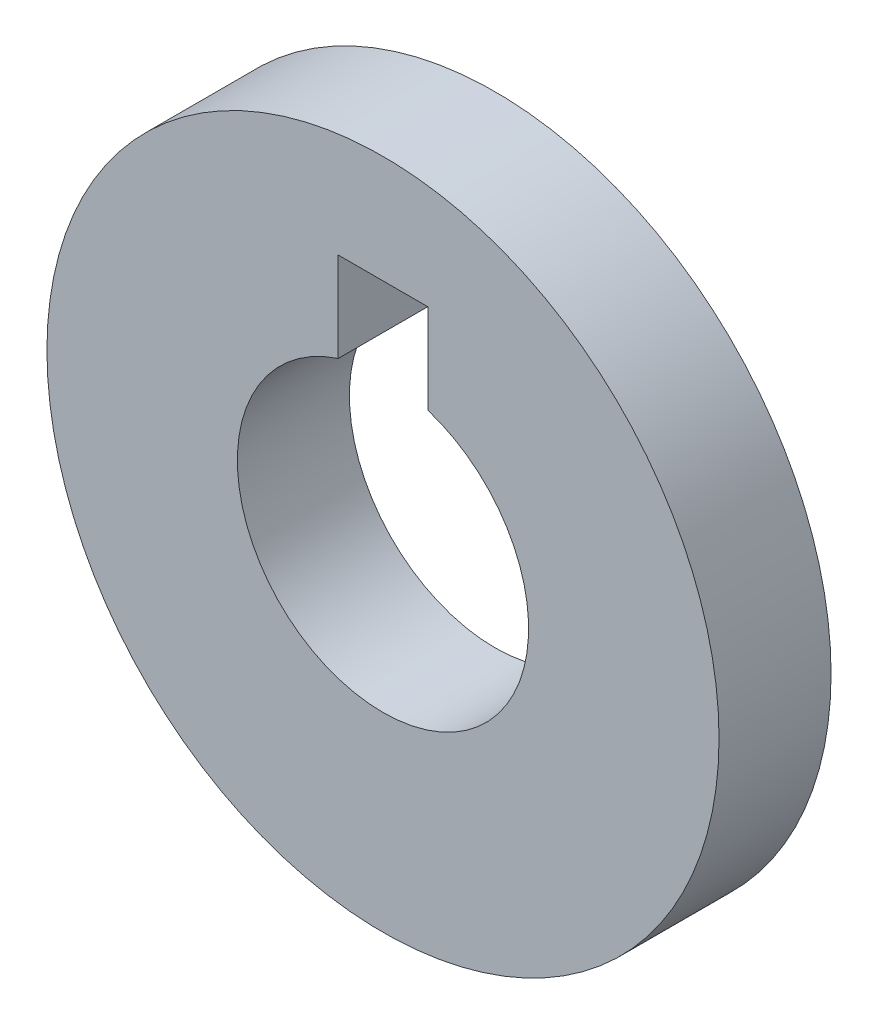
ISO-10303-21;
HEADER;
FILE_DESCRIPTION(('STEP AP214'),'2;1');
FILE_NAME('part.step','',(''),(''),'','','');
FILE_SCHEMA(('AUTOMOTIVE_DESIGN { 1 0 10303 214 1 1 1 1 }'));
ENDSEC;
DATA;
#1=APPLICATION_CONTEXT('core data for automotive mechanical design processes');
#2=APPLICATION_PROTOCOL_DEFINITION('international standard','automotive_design',2000,#1);
#3=PRODUCT_CONTEXT('',#1,'mechanical');
#4=PRODUCT('Part','Part','',(#3));
#5=PRODUCT_RELATED_PRODUCT_CATEGORY('part','',(#4));
#6=PRODUCT_DEFINITION_FORMATION('','',#4);
#7=PRODUCT_DEFINITION_CONTEXT('part definition',#1,'design');
#8=PRODUCT_DEFINITION('design','',#6,#7);
#9=PRODUCT_DEFINITION_SHAPE('','',#8);
#10=(LENGTH_UNIT() NAMED_UNIT(*) SI_UNIT(.MILLI.,.METRE.));
#11=(NAMED_UNIT(*) PLANE_ANGLE_UNIT() SI_UNIT($,.RADIAN.));
#12=(NAMED_UNIT(*) SI_UNIT($,.STERADIAN.) SOLID_ANGLE_UNIT());
#13=UNCERTAINTY_MEASURE_WITH_UNIT(LENGTH_MEASURE(1.E-05),#10,'distance_accuracy_value','');
#14=(GEOMETRIC_REPRESENTATION_CONTEXT(3) GLOBAL_UNCERTAINTY_ASSIGNED_CONTEXT((#13)) GLOBAL_UNIT_ASSIGNED_CONTEXT((#10,
#11,#12)) REPRESENTATION_CONTEXT('',''));
#15=CARTESIAN_POINT('',(0.,0.,0.));
#16=DIRECTION('',(0.,0.,1.));
#17=DIRECTION('',(1.,0.,0.));
#18=AXIS2_PLACEMENT_3D('',#15,#16,#17);
#19=CARTESIAN_POINT('',(0.,0.,5.));
#20=DIRECTION('',(0.,0.,1.));
#21=DIRECTION('',(1.,0.,0.));
#22=AXIS2_PLACEMENT_3D('',#19,#20,#21);
#23=PLANE('',#22);
#24=DIRECTION('',(0.,1.,0.));
#25=VECTOR('',#24,1.);
#26=CARTESIAN_POINT('',(2.,0.,5.));
#27=LINE('',#26,#25);
#28=CARTESIAN_POINT('',(2.,6.18465843842649,5.));
#29=VERTEX_POINT('',#28);
#30=CARTESIAN_POINT('',(2.,10.1846584384265,5.));
#31=VERTEX_POINT('',#30);
#32=EDGE_CURVE('E53',#29,#31,#27,.T.);
#33=ORIENTED_EDGE('',*,*,#32,.F.);
#34=CARTESIAN_POINT('',(0.,0.,5.));
#35=DIRECTION('',(0.,0.,1.));
#36=DIRECTION('',(1.,0.,0.));
#37=AXIS2_PLACEMENT_3D('',#34,#35,#36);
#38=CIRCLE('',#37,6.5);
#39=CARTESIAN_POINT('',(-2.,6.18465843842649,5.));
#40=VERTEX_POINT('',#39);
#41=EDGE_CURVE('E91',#40,#29,#38,.T.);
#42=ORIENTED_EDGE('',*,*,#41,.F.);
#43=DIRECTION('',(0.,-1.,0.));
#44=VECTOR('',#43,1.);
#45=CARTESIAN_POINT('',(-2.,0.,5.));
#46=LINE('',#45,#44);
#47=CARTESIAN_POINT('',(-2.,10.1846584384265,5.));
#48=VERTEX_POINT('',#47);
#49=EDGE_CURVE('E78',#48,#40,#46,.T.);
#50=ORIENTED_EDGE('',*,*,#49,.F.);
#51=DIRECTION('',(-1.,0.,0.));
#52=VECTOR('',#51,1.);
#53=CARTESIAN_POINT('',(0.,10.1846584384265,5.));
#54=LINE('',#53,#52);
#55=EDGE_CURVE('E92',#31,#48,#54,.T.);
#56=ORIENTED_EDGE('',*,*,#55,.F.);
#57=EDGE_LOOP('',(#33,#42,#50,#56));
#58=FACE_BOUND('',#57,.T.);
#59=CARTESIAN_POINT('',(0.,0.,5.));
#60=DIRECTION('',(0.,0.,1.));
#61=DIRECTION('',(1.,0.,0.));
#62=AXIS2_PLACEMENT_3D('',#59,#60,#61);
#63=CIRCLE('',#62,15.);
#64=CARTESIAN_POINT('',(15.,0.,5.));
#65=VERTEX_POINT('',#64);
#66=EDGE_CURVE('E98',#65,#65,#63,.T.);
#67=ORIENTED_EDGE('',*,*,#66,.T.);
#68=EDGE_LOOP('',(#67));
#69=FACE_BOUND('',#68,.T.);
#70=ADVANCED_FACE('F33',(#58,#69),#23,.T.);
#71=CARTESIAN_POINT('',(0.,0.,0.));
#72=DIRECTION('',(0.,0.,1.));
#73=DIRECTION('',(1.,0.,0.));
#74=AXIS2_PLACEMENT_3D('',#71,#72,#73);
#75=PLANE('',#74);
#76=CARTESIAN_POINT('',(0.,0.,0.));
#77=DIRECTION('',(0.,0.,1.));
#78=DIRECTION('',(1.,0.,0.));
#79=AXIS2_PLACEMENT_3D('',#76,#77,#78);
#80=CIRCLE('',#79,15.);
#81=CARTESIAN_POINT('',(15.,0.,0.));
#82=VERTEX_POINT('',#81);
#83=EDGE_CURVE('E94',#82,#82,#80,.T.);
#84=ORIENTED_EDGE('',*,*,#83,.F.);
#85=EDGE_LOOP('',(#84));
#86=FACE_BOUND('',#85,.T.);
#87=CARTESIAN_POINT('',(0.,0.,0.));
#88=DIRECTION('',(0.,0.,1.));
#89=DIRECTION('',(1.,0.,0.));
#90=AXIS2_PLACEMENT_3D('',#87,#88,#89);
#91=CIRCLE('',#90,6.5);
#92=CARTESIAN_POINT('',(-2.,6.18465843842649,0.));
#93=VERTEX_POINT('',#92);
#94=CARTESIAN_POINT('',(2.,6.18465843842649,0.));
#95=VERTEX_POINT('',#94);
#96=EDGE_CURVE('E86',#93,#95,#91,.T.);
#97=ORIENTED_EDGE('',*,*,#96,.T.);
#98=DIRECTION('',(0.,-1.,0.));
#99=VECTOR('',#98,1.);
#100=CARTESIAN_POINT('',(2.,10.1846584384265,0.));
#101=LINE('',#100,#99);
#102=CARTESIAN_POINT('',(2.,10.1846584384265,0.));
#103=VERTEX_POINT('',#102);
#104=EDGE_CURVE('E48',#103,#95,#101,.T.);
#105=ORIENTED_EDGE('',*,*,#104,.F.);
#106=DIRECTION('',(1.,0.,0.));
#107=VECTOR('',#106,1.);
#108=CARTESIAN_POINT('',(2.,10.1846584384265,0.));
#109=LINE('',#108,#107);
#110=CARTESIAN_POINT('',(-2.,10.1846584384265,0.));
#111=VERTEX_POINT('',#110);
#112=EDGE_CURVE('E88',#111,#103,#109,.T.);
#113=ORIENTED_EDGE('',*,*,#112,.F.);
#114=DIRECTION('',(0.,1.,0.));
#115=VECTOR('',#114,1.);
#116=CARTESIAN_POINT('',(-2.,10.1846584384265,0.));
#117=LINE('',#116,#115);
#118=EDGE_CURVE('E75',#93,#111,#117,.T.);
#119=ORIENTED_EDGE('',*,*,#118,.F.);
#120=EDGE_LOOP('',(#97,#105,#113,#119));
#121=FACE_BOUND('',#120,.T.);
#122=ADVANCED_FACE('F85',(#86,#121),#75,.F.);
#123=CARTESIAN_POINT('',(0.,0.,5.));
#124=DIRECTION('',(0.,0.,-1.));
#125=DIRECTION('',(-1.,0.,0.));
#126=AXIS2_PLACEMENT_3D('',#123,#124,#125);
#127=CYLINDRICAL_SURFACE('',#126,15.);
#128=ORIENTED_EDGE('',*,*,#66,.F.);
#129=EDGE_LOOP('',(#128));
#130=FACE_BOUND('',#129,.T.);
#131=ORIENTED_EDGE('',*,*,#83,.T.);
#132=EDGE_LOOP('',(#131));
#133=FACE_BOUND('',#132,.T.);
#134=ADVANCED_FACE('F35',(#130,#133),#127,.T.);
#135=CARTESIAN_POINT('',(0.,0.,5.));
#136=DIRECTION('',(0.,0.,-1.));
#137=DIRECTION('',(-1.,0.,0.));
#138=AXIS2_PLACEMENT_3D('',#135,#136,#137);
#139=CYLINDRICAL_SURFACE('',#138,6.5);
#140=DIRECTION('',(0.,0.,-1.));
#141=VECTOR('',#140,1.);
#142=CARTESIAN_POINT('',(-2.,6.18465843842649,5.));
#143=LINE('',#142,#141);
#144=EDGE_CURVE('E11',#40,#93,#143,.T.);
#145=ORIENTED_EDGE('',*,*,#144,.F.);
#146=ORIENTED_EDGE('',*,*,#41,.T.);
#147=DIRECTION('',(0.,0.,-1.));
#148=VECTOR('',#147,1.);
#149=CARTESIAN_POINT('',(2.,6.18465843842649,5.));
#150=LINE('',#149,#148);
#151=EDGE_CURVE('E41',#95,#29,#150,.F.);
#152=ORIENTED_EDGE('',*,*,#151,.F.);
#153=ORIENTED_EDGE('',*,*,#96,.F.);
#154=EDGE_LOOP('',(#145,#146,#152,#153));
#155=FACE_BOUND('',#154,.T.);
#156=ADVANCED_FACE('F90',(#155),#139,.F.);
#157=CARTESIAN_POINT('',(2.,10.1846584384265,8.));
#158=DIRECTION('',(1.,0.,0.));
#159=DIRECTION('',(0.,1.,0.));
#160=AXIS2_PLACEMENT_3D('',#157,#158,#159);
#161=PLANE('',#160);
#162=ORIENTED_EDGE('',*,*,#32,.T.);
#163=DIRECTION('',(0.,0.,-1.));
#164=VECTOR('',#163,1.);
#165=CARTESIAN_POINT('',(2.,10.1846584384265,8.));
#166=LINE('',#165,#164);
#167=EDGE_CURVE('E107',#31,#103,#166,.T.);
#168=ORIENTED_EDGE('',*,*,#167,.T.);
#169=ORIENTED_EDGE('',*,*,#104,.T.);
#170=ORIENTED_EDGE('',*,*,#151,.T.);
#171=EDGE_LOOP('',(#162,#168,#169,#170));
#172=FACE_BOUND('',#171,.T.);
#173=ADVANCED_FACE('F102',(#172),#161,.F.);
#174=CARTESIAN_POINT('',(2.,10.1846584384265,8.));
#175=DIRECTION('',(0.,1.,0.));
#176=DIRECTION('',(0.,0.,1.));
#177=AXIS2_PLACEMENT_3D('',#174,#175,#176);
#178=PLANE('',#177);
#179=ORIENTED_EDGE('',*,*,#55,.T.);
#180=DIRECTION('',(0.,0.,-1.));
#181=VECTOR('',#180,1.);
#182=CARTESIAN_POINT('',(-2.,10.1846584384265,8.));
#183=LINE('',#182,#181);
#184=EDGE_CURVE('E110',#48,#111,#183,.T.);
#185=ORIENTED_EDGE('',*,*,#184,.T.);
#186=ORIENTED_EDGE('',*,*,#112,.T.);
#187=ORIENTED_EDGE('',*,*,#167,.F.);
#188=EDGE_LOOP('',(#179,#185,#186,#187));
#189=FACE_BOUND('',#188,.T.);
#190=ADVANCED_FACE('F115',(#189),#178,.F.);
#191=CARTESIAN_POINT('',(-2.,10.1846584384265,8.));
#192=DIRECTION('',(-1.,0.,0.));
#193=DIRECTION('',(0.,-1.,0.));
#194=AXIS2_PLACEMENT_3D('',#191,#192,#193);
#195=PLANE('',#194);
#196=ORIENTED_EDGE('',*,*,#49,.T.);
#197=ORIENTED_EDGE('',*,*,#144,.T.);
#198=ORIENTED_EDGE('',*,*,#118,.T.);
#199=ORIENTED_EDGE('',*,*,#184,.F.);
#200=EDGE_LOOP('',(#196,#197,#198,#199));
#201=FACE_BOUND('',#200,.T.);
#202=ADVANCED_FACE('F73',(#201),#195,.F.);
#203=CLOSED_SHELL('',(#70,#122,#134,#156,#173,#190,#202));
#204=MANIFOLD_SOLID_BREP('B2',#203);
#205=ADVANCED_BREP_SHAPE_REPRESENTATION('',(#18,#204),#14);
#206=SHAPE_DEFINITION_REPRESENTATION(#9,#205);
ENDSEC;
END-ISO-10303-21;
